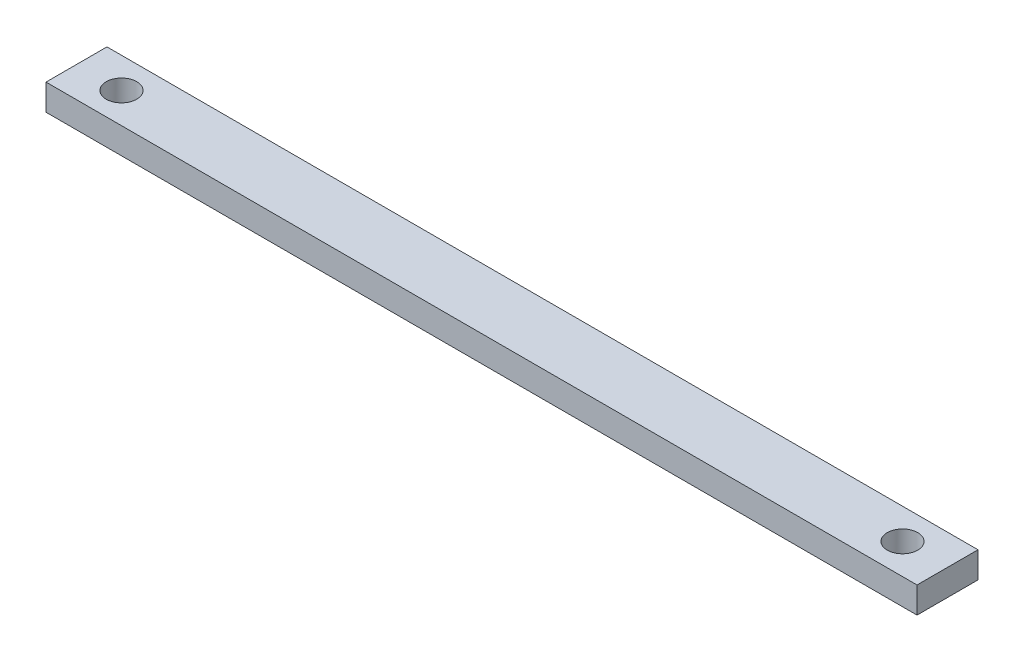
ISO-10303-21;
HEADER;
FILE_DESCRIPTION(('STEP AP214'),'2;1');
FILE_NAME('part.step','',(''),(''),'','','');
FILE_SCHEMA(('AUTOMOTIVE_DESIGN { 1 0 10303 214 1 1 1 1 }'));
ENDSEC;
DATA;
#1=APPLICATION_CONTEXT('core data for automotive mechanical design processes');
#2=APPLICATION_PROTOCOL_DEFINITION('international standard','automotive_design',2000,#1);
#3=PRODUCT_CONTEXT('',#1,'mechanical');
#4=PRODUCT('Part','Part','',(#3));
#5=PRODUCT_RELATED_PRODUCT_CATEGORY('part','',(#4));
#6=PRODUCT_DEFINITION_FORMATION('','',#4);
#7=PRODUCT_DEFINITION_CONTEXT('part definition',#1,'design');
#8=PRODUCT_DEFINITION('design','',#6,#7);
#9=PRODUCT_DEFINITION_SHAPE('','',#8);
#10=(LENGTH_UNIT() NAMED_UNIT(*) SI_UNIT(.MILLI.,.METRE.));
#11=(NAMED_UNIT(*) PLANE_ANGLE_UNIT() SI_UNIT($,.RADIAN.));
#12=(NAMED_UNIT(*) SI_UNIT($,.STERADIAN.) SOLID_ANGLE_UNIT());
#13=UNCERTAINTY_MEASURE_WITH_UNIT(LENGTH_MEASURE(1.E-05),#10,'distance_accuracy_value','');
#14=(GEOMETRIC_REPRESENTATION_CONTEXT(3) GLOBAL_UNCERTAINTY_ASSIGNED_CONTEXT((#13)) GLOBAL_UNIT_ASSIGNED_CONTEXT((#10,
#11,#12)) REPRESENTATION_CONTEXT('',''));
#15=CARTESIAN_POINT('',(0.,0.,0.));
#16=DIRECTION('',(0.,0.,1.));
#17=DIRECTION('',(1.,0.,0.));
#18=AXIS2_PLACEMENT_3D('',#15,#16,#17);
#19=CARTESIAN_POINT('',(300.,18.,21.));
#20=DIRECTION('',(-1.,0.,0.));
#21=DIRECTION('',(0.,0.,1.));
#22=AXIS2_PLACEMENT_3D('',#19,#20,#21);
#23=PLANE('',#22);
#24=DIRECTION('',(0.,0.,-1.));
#25=VECTOR('',#24,1.);
#26=CARTESIAN_POINT('',(300.,0.,21.));
#27=LINE('',#26,#25);
#28=CARTESIAN_POINT('',(300.,0.,21.));
#29=VERTEX_POINT('',#28);
#30=CARTESIAN_POINT('',(300.,0.,-21.));
#31=VERTEX_POINT('',#30);
#32=EDGE_CURVE('E103',#29,#31,#27,.T.);
#33=ORIENTED_EDGE('',*,*,#32,.T.);
#34=DIRECTION('',(0.,-1.,0.));
#35=VECTOR('',#34,1.);
#36=CARTESIAN_POINT('',(300.,18.,-21.));
#37=LINE('',#36,#35);
#38=CARTESIAN_POINT('',(300.,18.,-21.));
#39=VERTEX_POINT('',#38);
#40=EDGE_CURVE('E11',#39,#31,#37,.T.);
#41=ORIENTED_EDGE('',*,*,#40,.F.);
#42=DIRECTION('',(0.,0.,-1.));
#43=VECTOR('',#42,1.);
#44=CARTESIAN_POINT('',(300.,18.,21.));
#45=LINE('',#44,#43);
#46=CARTESIAN_POINT('',(300.,18.,21.));
#47=VERTEX_POINT('',#46);
#48=EDGE_CURVE('E90',#47,#39,#45,.T.);
#49=ORIENTED_EDGE('',*,*,#48,.F.);
#50=DIRECTION('',(0.,-1.,0.));
#51=VECTOR('',#50,1.);
#52=CARTESIAN_POINT('',(300.,18.,21.));
#53=LINE('',#52,#51);
#54=EDGE_CURVE('E99',#47,#29,#53,.T.);
#55=ORIENTED_EDGE('',*,*,#54,.T.);
#56=EDGE_LOOP('',(#33,#41,#49,#55));
#57=FACE_BOUND('',#56,.T.);
#58=ADVANCED_FACE('F37',(#57),#23,.F.);
#59=CARTESIAN_POINT('',(-300.,18.,-21.));
#60=DIRECTION('',(0.,0.,1.));
#61=DIRECTION('',(1.,0.,0.));
#62=AXIS2_PLACEMENT_3D('',#59,#60,#61);
#63=PLANE('',#62);
#64=DIRECTION('',(-1.,0.,0.));
#65=VECTOR('',#64,1.);
#66=CARTESIAN_POINT('',(-300.,0.,-21.));
#67=LINE('',#66,#65);
#68=CARTESIAN_POINT('',(-300.,0.,-21.));
#69=VERTEX_POINT('',#68);
#70=EDGE_CURVE('E94',#31,#69,#67,.T.);
#71=ORIENTED_EDGE('',*,*,#70,.T.);
#72=DIRECTION('',(0.,-1.,0.));
#73=VECTOR('',#72,1.);
#74=CARTESIAN_POINT('',(-300.,18.,-21.));
#75=LINE('',#74,#73);
#76=CARTESIAN_POINT('',(-300.,18.,-21.));
#77=VERTEX_POINT('',#76);
#78=EDGE_CURVE('E46',#77,#69,#75,.T.);
#79=ORIENTED_EDGE('',*,*,#78,.F.);
#80=DIRECTION('',(-1.,0.,0.));
#81=VECTOR('',#80,1.);
#82=CARTESIAN_POINT('',(-300.,18.,-21.));
#83=LINE('',#82,#81);
#84=EDGE_CURVE('E85',#39,#77,#83,.T.);
#85=ORIENTED_EDGE('',*,*,#84,.F.);
#86=ORIENTED_EDGE('',*,*,#40,.T.);
#87=EDGE_LOOP('',(#71,#79,#85,#86));
#88=FACE_BOUND('',#87,.T.);
#89=ADVANCED_FACE('F93',(#88),#63,.F.);
#90=CARTESIAN_POINT('',(-300.,18.,21.));
#91=DIRECTION('',(1.,0.,0.));
#92=DIRECTION('',(0.,0.,-1.));
#93=AXIS2_PLACEMENT_3D('',#90,#91,#92);
#94=PLANE('',#93);
#95=DIRECTION('',(0.,0.,1.));
#96=VECTOR('',#95,1.);
#97=CARTESIAN_POINT('',(-300.,0.,21.));
#98=LINE('',#97,#96);
#99=CARTESIAN_POINT('',(-300.,0.,21.));
#100=VERTEX_POINT('',#99);
#101=EDGE_CURVE('E72',#69,#100,#98,.T.);
#102=ORIENTED_EDGE('',*,*,#101,.T.);
#103=DIRECTION('',(0.,-1.,0.));
#104=VECTOR('',#103,1.);
#105=CARTESIAN_POINT('',(-300.,18.,21.));
#106=LINE('',#105,#104);
#107=CARTESIAN_POINT('',(-300.,18.,21.));
#108=VERTEX_POINT('',#107);
#109=EDGE_CURVE('E95',#108,#100,#106,.T.);
#110=ORIENTED_EDGE('',*,*,#109,.F.);
#111=DIRECTION('',(0.,0.,1.));
#112=VECTOR('',#111,1.);
#113=CARTESIAN_POINT('',(-300.,18.,21.));
#114=LINE('',#113,#112);
#115=EDGE_CURVE('E88',#77,#108,#114,.T.);
#116=ORIENTED_EDGE('',*,*,#115,.F.);
#117=ORIENTED_EDGE('',*,*,#78,.T.);
#118=EDGE_LOOP('',(#102,#110,#116,#117));
#119=FACE_BOUND('',#118,.T.);
#120=ADVANCED_FACE('F97',(#119),#94,.F.);
#121=CARTESIAN_POINT('',(-300.,18.,21.));
#122=DIRECTION('',(0.,0.,-1.));
#123=DIRECTION('',(-1.,0.,0.));
#124=AXIS2_PLACEMENT_3D('',#121,#122,#123);
#125=PLANE('',#124);
#126=DIRECTION('',(1.,0.,0.));
#127=VECTOR('',#126,1.);
#128=CARTESIAN_POINT('',(-300.,0.,21.));
#129=LINE('',#128,#127);
#130=EDGE_CURVE('E78',#100,#29,#129,.T.);
#131=ORIENTED_EDGE('',*,*,#130,.T.);
#132=ORIENTED_EDGE('',*,*,#54,.F.);
#133=DIRECTION('',(1.,0.,0.));
#134=VECTOR('',#133,1.);
#135=CARTESIAN_POINT('',(-300.,18.,21.));
#136=LINE('',#135,#134);
#137=EDGE_CURVE('E55',#108,#47,#136,.T.);
#138=ORIENTED_EDGE('',*,*,#137,.F.);
#139=ORIENTED_EDGE('',*,*,#109,.T.);
#140=EDGE_LOOP('',(#131,#132,#138,#139));
#141=FACE_BOUND('',#140,.T.);
#142=ADVANCED_FACE('F129',(#141),#125,.F.);
#143=CARTESIAN_POINT('',(0.,18.,0.));
#144=DIRECTION('',(0.,-1.,0.));
#145=DIRECTION('',(0.,0.,-1.));
#146=AXIS2_PLACEMENT_3D('',#143,#144,#145);
#147=PLANE('',#146);
#148=CARTESIAN_POINT('',(269.,18.,0.));
#149=DIRECTION('',(0.,1.,0.));
#150=DIRECTION('',(0.,0.,1.));
#151=AXIS2_PLACEMENT_3D('',#148,#149,#150);
#152=CIRCLE('',#151,10.5);
#153=CARTESIAN_POINT('',(269.,18.,10.5));
#154=VERTEX_POINT('',#153);
#155=EDGE_CURVE('E112',#154,#154,#152,.T.);
#156=ORIENTED_EDGE('',*,*,#155,.F.);
#157=EDGE_LOOP('',(#156));
#158=FACE_BOUND('',#157,.T.);
#159=CARTESIAN_POINT('',(-269.,18.,0.));
#160=DIRECTION('',(0.,1.,0.));
#161=DIRECTION('',(0.,0.,1.));
#162=AXIS2_PLACEMENT_3D('',#159,#160,#161);
#163=CIRCLE('',#162,10.5);
#164=CARTESIAN_POINT('',(-269.,18.,10.5));
#165=VERTEX_POINT('',#164);
#166=EDGE_CURVE('E117',#165,#165,#163,.T.);
#167=ORIENTED_EDGE('',*,*,#166,.F.);
#168=EDGE_LOOP('',(#167));
#169=FACE_BOUND('',#168,.T.);
#170=ORIENTED_EDGE('',*,*,#48,.T.);
#171=ORIENTED_EDGE('',*,*,#84,.T.);
#172=ORIENTED_EDGE('',*,*,#115,.T.);
#173=ORIENTED_EDGE('',*,*,#137,.T.);
#174=EDGE_LOOP('',(#170,#171,#172,#173));
#175=FACE_BOUND('',#174,.T.);
#176=ADVANCED_FACE('F86',(#158,#169,#175),#147,.F.);
#177=CARTESIAN_POINT('',(0.,0.,0.));
#178=DIRECTION('',(0.,-1.,0.));
#179=DIRECTION('',(0.,0.,-1.));
#180=AXIS2_PLACEMENT_3D('',#177,#178,#179);
#181=PLANE('',#180);
#182=CARTESIAN_POINT('',(269.,0.,0.));
#183=DIRECTION('',(0.,-1.,0.));
#184=DIRECTION('',(0.,0.,-1.));
#185=AXIS2_PLACEMENT_3D('',#182,#183,#184);
#186=CIRCLE('',#185,10.5);
#187=CARTESIAN_POINT('',(269.,0.,-10.5));
#188=VERTEX_POINT('',#187);
#189=EDGE_CURVE('E40',#188,#188,#186,.T.);
#190=ORIENTED_EDGE('',*,*,#189,.F.);
#191=EDGE_LOOP('',(#190));
#192=FACE_BOUND('',#191,.T.);
#193=CARTESIAN_POINT('',(-269.,0.,0.));
#194=DIRECTION('',(0.,-1.,0.));
#195=DIRECTION('',(0.,0.,-1.));
#196=AXIS2_PLACEMENT_3D('',#193,#194,#195);
#197=CIRCLE('',#196,10.5);
#198=CARTESIAN_POINT('',(-269.,0.,-10.5));
#199=VERTEX_POINT('',#198);
#200=EDGE_CURVE('E110',#199,#199,#197,.T.);
#201=ORIENTED_EDGE('',*,*,#200,.F.);
#202=EDGE_LOOP('',(#201));
#203=FACE_BOUND('',#202,.T.);
#204=ORIENTED_EDGE('',*,*,#32,.F.);
#205=ORIENTED_EDGE('',*,*,#130,.F.);
#206=ORIENTED_EDGE('',*,*,#101,.F.);
#207=ORIENTED_EDGE('',*,*,#70,.F.);
#208=EDGE_LOOP('',(#204,#205,#206,#207));
#209=FACE_BOUND('',#208,.T.);
#210=ADVANCED_FACE('F128',(#192,#203,#209),#181,.T.);
#211=CARTESIAN_POINT('',(-269.,-2.,0.));
#212=DIRECTION('',(0.,1.,0.));
#213=DIRECTION('',(0.,0.,1.));
#214=AXIS2_PLACEMENT_3D('',#211,#212,#213);
#215=CYLINDRICAL_SURFACE('',#214,10.5);
#216=ORIENTED_EDGE('',*,*,#200,.T.);
#217=EDGE_LOOP('',(#216));
#218=FACE_BOUND('',#217,.T.);
#219=ORIENTED_EDGE('',*,*,#166,.T.);
#220=EDGE_LOOP('',(#219));
#221=FACE_BOUND('',#220,.T.);
#222=ADVANCED_FACE('F125',(#218,#221),#215,.F.);
#223=CARTESIAN_POINT('',(269.,-2.,0.));
#224=DIRECTION('',(0.,1.,0.));
#225=DIRECTION('',(0.,0.,1.));
#226=AXIS2_PLACEMENT_3D('',#223,#224,#225);
#227=CYLINDRICAL_SURFACE('',#226,10.5);
#228=ORIENTED_EDGE('',*,*,#189,.T.);
#229=EDGE_LOOP('',(#228));
#230=FACE_BOUND('',#229,.T.);
#231=ORIENTED_EDGE('',*,*,#155,.T.);
#232=EDGE_LOOP('',(#231));
#233=FACE_BOUND('',#232,.T.);
#234=ADVANCED_FACE('F179',(#230,#233),#227,.F.);
#235=CLOSED_SHELL('',(#58,#89,#120,#142,#176,#210,#222,#234));
#236=MANIFOLD_SOLID_BREP('B2',#235);
#237=ADVANCED_BREP_SHAPE_REPRESENTATION('',(#18,#236),#14);
#238=SHAPE_DEFINITION_REPRESENTATION(#9,#237);
ENDSEC;
END-ISO-10303-21;
